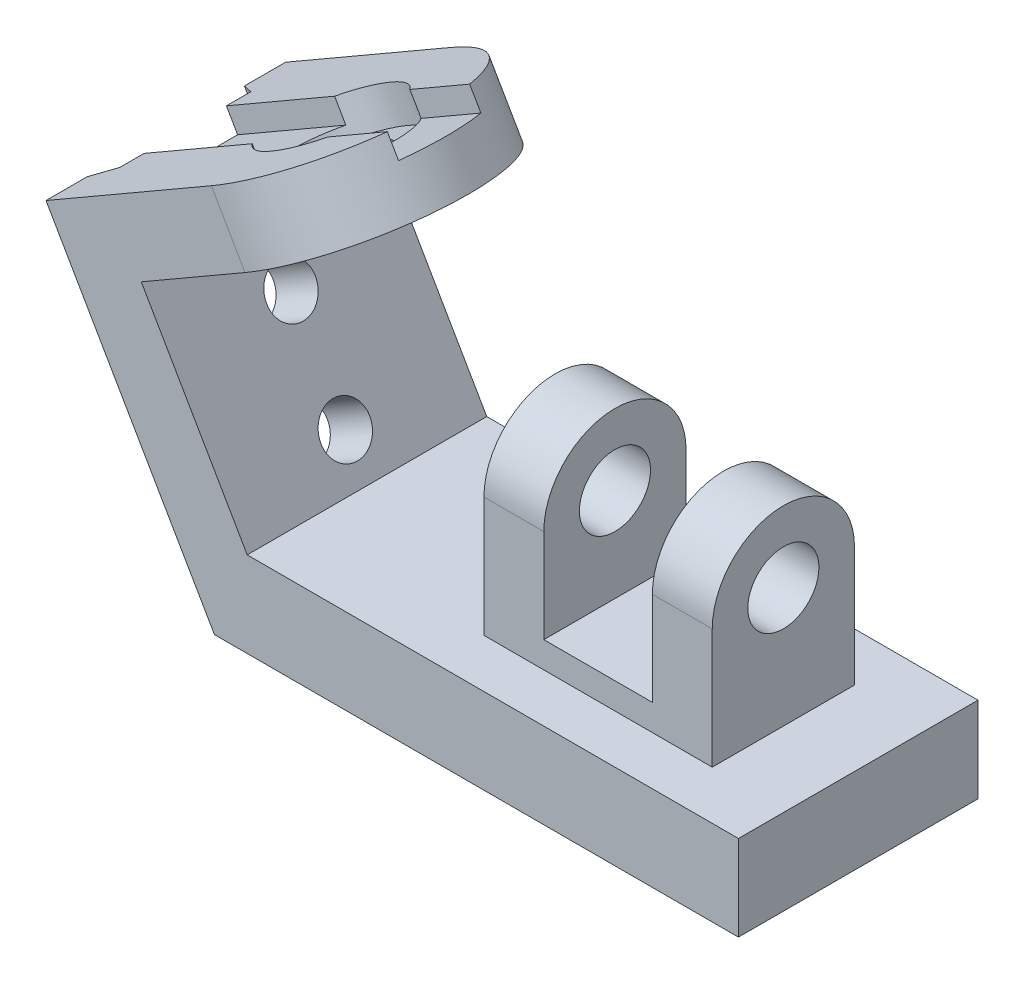
ISO-10303-21;
HEADER;
FILE_DESCRIPTION(('STEP AP214'),'2;1');
FILE_NAME('part.step','',(''),(''),'','','');
FILE_SCHEMA(('AUTOMOTIVE_DESIGN { 1 0 10303 214 1 1 1 1 }'));
ENDSEC;
DATA;
#1=APPLICATION_CONTEXT('core data for automotive mechanical design processes');
#2=APPLICATION_PROTOCOL_DEFINITION('international standard','automotive_design',2000,#1);
#3=PRODUCT_CONTEXT('',#1,'mechanical');
#4=PRODUCT('Part','Part','',(#3));
#5=PRODUCT_RELATED_PRODUCT_CATEGORY('part','',(#4));
#6=PRODUCT_DEFINITION_FORMATION('','',#4);
#7=PRODUCT_DEFINITION_CONTEXT('part definition',#1,'design');
#8=PRODUCT_DEFINITION('design','',#6,#7);
#9=PRODUCT_DEFINITION_SHAPE('','',#8);
#10=(LENGTH_UNIT() NAMED_UNIT(*) SI_UNIT(.MILLI.,.METRE.));
#11=(NAMED_UNIT(*) PLANE_ANGLE_UNIT() SI_UNIT($,.RADIAN.));
#12=(NAMED_UNIT(*) SI_UNIT($,.STERADIAN.) SOLID_ANGLE_UNIT());
#13=UNCERTAINTY_MEASURE_WITH_UNIT(LENGTH_MEASURE(1.E-05),#10,'distance_accuracy_value','');
#14=(GEOMETRIC_REPRESENTATION_CONTEXT(3) GLOBAL_UNCERTAINTY_ASSIGNED_CONTEXT((#13)) GLOBAL_UNIT_ASSIGNED_CONTEXT((#10,
#11,#12)) REPRESENTATION_CONTEXT('',''));
#15=CARTESIAN_POINT('',(0.,0.,0.));
#16=DIRECTION('',(0.,0.,1.));
#17=DIRECTION('',(1.,0.,0.));
#18=AXIS2_PLACEMENT_3D('',#15,#16,#17);
#19=CARTESIAN_POINT('',(120.,29.8306377793255,0.));
#20=DIRECTION('',(0.,1.,0.));
#21=DIRECTION('',(0.,0.,1.));
#22=AXIS2_PLACEMENT_3D('',#19,#20,#21);
#23=PLANE('',#22);
#24=DIRECTION('',(-1.,0.,0.));
#25=VECTOR('',#24,1.);
#26=CARTESIAN_POINT('',(120.,29.8306377793255,-19.));
#27=LINE('',#26,#25);
#28=CARTESIAN_POINT('',(104.,29.8306377793255,-19.));
#29=VERTEX_POINT('',#28);
#30=CARTESIAN_POINT('',(75.,29.8306377793255,-19.));
#31=VERTEX_POINT('',#30);
#32=EDGE_CURVE('E286',#29,#31,#27,.T.);
#33=ORIENTED_EDGE('',*,*,#32,.T.);
#34=DIRECTION('',(0.,0.,-1.));
#35=VECTOR('',#34,1.);
#36=CARTESIAN_POINT('',(75.,29.8306377793255,0.));
#37=LINE('',#36,#35);
#38=CARTESIAN_POINT('',(75.,29.8306377793255,19.));
#39=VERTEX_POINT('',#38);
#40=EDGE_CURVE('E859',#39,#31,#37,.T.);
#41=ORIENTED_EDGE('',*,*,#40,.F.);
#42=DIRECTION('',(-1.,0.,0.));
#43=VECTOR('',#42,1.);
#44=CARTESIAN_POINT('',(120.,29.8306377793255,19.));
#45=LINE('',#44,#43);
#46=CARTESIAN_POINT('',(104.,29.8306377793255,19.));
#47=VERTEX_POINT('',#46);
#48=EDGE_CURVE('E283',#47,#39,#45,.T.);
#49=ORIENTED_EDGE('',*,*,#48,.F.);
#50=DIRECTION('',(0.,0.,-1.));
#51=VECTOR('',#50,1.);
#52=CARTESIAN_POINT('',(104.,29.8306377793255,0.));
#53=LINE('',#52,#51);
#54=EDGE_CURVE('E265',#47,#29,#53,.T.);
#55=ORIENTED_EDGE('',*,*,#54,.T.);
#56=EDGE_LOOP('',(#33,#41,#49,#55));
#57=FACE_BOUND('',#56,.T.);
#58=ADVANCED_FACE('F35',(#57),#23,.T.);
#59=CARTESIAN_POINT('',(42.2563922654939,121.391584673323,11.));
#60=DIRECTION('',(0.,0.,1.));
#61=DIRECTION('',(1.,0.,0.));
#62=AXIS2_PLACEMENT_3D('',#59,#60,#61);
#63=PLANE('',#62);
#64=DIRECTION('',(0.866025403784436,0.500000000000004,0.));
#65=VECTOR('',#64,1.);
#66=CARTESIAN_POINT('',(42.2563922654939,121.391584673323,11.));
#67=LINE('',#66,#65);
#68=CARTESIAN_POINT('',(12.2296014917549,104.055608937204,11.));
#69=VERTEX_POINT('',#68);
#70=CARTESIAN_POINT('',(28.191322952352,113.27111311921,11.));
#71=VERTEX_POINT('',#70);
#72=EDGE_CURVE('E327',#69,#71,#67,.T.);
#73=ORIENTED_EDGE('',*,*,#72,.F.);
#74=DIRECTION('',(-0.500000000000004,0.866025403784436,0.));
#75=VECTOR('',#74,1.);
#76=CARTESIAN_POINT('',(13.7296014917549,101.457532725851,11.));
#77=LINE('',#76,#75);
#78=CARTESIAN_POINT('',(9.22960149175486,109.251761359911,11.));
#79=VERTEX_POINT('',#78);
#80=EDGE_CURVE('E311',#69,#79,#77,.T.);
#81=ORIENTED_EDGE('',*,*,#80,.T.);
#82=DIRECTION('',(0.866025403784436,0.500000000000004,0.));
#83=VECTOR('',#82,1.);
#84=CARTESIAN_POINT('',(39.2563922654938,126.58773709603,11.));
#85=LINE('',#84,#83);
#86=CARTESIAN_POINT('',(25.191322952352,118.467265541916,11.));
#87=VERTEX_POINT('',#86);
#88=EDGE_CURVE('E336',#79,#87,#85,.T.);
#89=ORIENTED_EDGE('',*,*,#88,.T.);
#90=DIRECTION('',(-0.500000000000004,0.866025403784436,0.));
#91=VECTOR('',#90,1.);
#92=CARTESIAN_POINT('',(34.1913229523521,102.878808273796,11.));
#93=LINE('',#92,#91);
#94=EDGE_CURVE('E345',#71,#87,#93,.T.);
#95=ORIENTED_EDGE('',*,*,#94,.F.);
#96=EDGE_LOOP('',(#73,#81,#89,#95));
#97=FACE_BOUND('',#96,.T.);
#98=ADVANCED_FACE('F478',(#97),#63,.F.);
#99=CARTESIAN_POINT('',(42.2563922654939,121.391584673323,-11.));
#100=DIRECTION('',(0.,0.,-1.));
#101=DIRECTION('',(-1.,0.,0.));
#102=AXIS2_PLACEMENT_3D('',#99,#100,#101);
#103=PLANE('',#102);
#104=DIRECTION('',(-0.866025403784436,-0.500000000000004,0.));
#105=VECTOR('',#104,1.);
#106=CARTESIAN_POINT('',(42.2563922654939,121.391584673323,-11.));
#107=LINE('',#106,#105);
#108=CARTESIAN_POINT('',(-7.89501030574315,92.4366588985817,-11.));
#109=VERTEX_POINT('',#108);
#110=CARTESIAN_POINT('',(-36.8038475772938,75.7461339178927,-11.));
#111=VERTEX_POINT('',#110);
#112=EDGE_CURVE('E328',#109,#111,#107,.T.);
#113=ORIENTED_EDGE('',*,*,#112,.F.);
#114=DIRECTION('',(-0.500000000000004,0.866025403784436,0.));
#115=VECTOR('',#114,1.);
#116=CARTESIAN_POINT('',(-6.39501030574311,89.8385826872284,-11.));
#117=LINE('',#116,#115);
#118=CARTESIAN_POINT('',(-10.8950103057431,97.6328113212883,-11.));
#119=VERTEX_POINT('',#118);
#120=EDGE_CURVE('E314',#109,#119,#117,.T.);
#121=ORIENTED_EDGE('',*,*,#120,.T.);
#122=DIRECTION('',(-0.866025403784436,-0.500000000000004,0.));
#123=VECTOR('',#122,1.);
#124=CARTESIAN_POINT('',(39.2563922654938,126.58773709603,-11.));
#125=LINE('',#124,#123);
#126=CARTESIAN_POINT('',(-39.8038475772938,80.9422863405993,-11.));
#127=VERTEX_POINT('',#126);
#128=EDGE_CURVE('E323',#119,#127,#125,.T.);
#129=ORIENTED_EDGE('',*,*,#128,.T.);
#130=DIRECTION('',(-0.500000000000004,0.866025403784436,0.));
#131=VECTOR('',#130,1.);
#132=CARTESIAN_POINT('',(40.1961524227072,-57.621778264911,-11.));
#133=LINE('',#132,#131);
#134=EDGE_CURVE('E446',#111,#127,#133,.T.);
#135=ORIENTED_EDGE('',*,*,#134,.F.);
#136=EDGE_LOOP('',(#113,#121,#129,#135));
#137=FACE_BOUND('',#136,.T.);
#138=ADVANCED_FACE('F472',(#137),#103,.F.);
#139=CARTESIAN_POINT('',(-42.0000000000004,72.7461339178927,0.));
#140=DIRECTION('',(0.500000000000004,-0.866025403784436,0.));
#141=DIRECTION('',(0.866025403784436,0.500000000000004,0.));
#142=AXIS2_PLACEMENT_3D('',#139,#140,#141);
#143=PLANE('',#142);
#144=CARTESIAN_POINT('',(-36.8038475772937,75.7461339178927,11.));
#145=VERTEX_POINT('',#144);
#146=CARTESIAN_POINT('',(-7.89501030574314,92.4366588985817,11.));
#147=VERTEX_POINT('',#146);
#148=EDGE_CURVE('E329',#145,#147,#67,.T.);
#149=ORIENTED_EDGE('',*,*,#148,.T.);
#150=CARTESIAN_POINT('',(2.16729559300585,98.2461339178929,0.));
#151=DIRECTION('',(0.500000000000004,-0.866025403784436,0.));
#152=DIRECTION('',(0.866025403784436,0.500000000000004,0.));
#153=AXIS2_PLACEMENT_3D('',#150,#151,#152);
#154=CIRCLE('',#153,16.);
#155=EDGE_CURVE('E11',#147,#109,#154,.T.);
#156=ORIENTED_EDGE('',*,*,#155,.T.);
#157=ORIENTED_EDGE('',*,*,#112,.T.);
#158=DIRECTION('',(0.,0.,-1.));
#159=VECTOR('',#158,1.);
#160=CARTESIAN_POINT('',(-36.8038475772938,75.7461339178927,-17.5358983848623));
#161=LINE('',#160,#159);
#162=EDGE_CURVE('E443',#145,#111,#161,.T.);
#163=ORIENTED_EDGE('',*,*,#162,.F.);
#164=EDGE_LOOP('',(#149,#156,#157,#163));
#165=FACE_BOUND('',#164,.T.);
#166=ADVANCED_FACE('F459',(#165),#143,.F.);
#167=CARTESIAN_POINT('',(17.167295593006,72.2653718043598,0.));
#168=DIRECTION('',(-0.500000000000004,0.866025403784436,0.));
#169=DIRECTION('',(-0.866025403784436,-0.500000000000004,0.));
#170=AXIS2_PLACEMENT_3D('',#167,#168,#169);
#171=CYLINDRICAL_SURFACE('',#170,9.5);
#172=CARTESIAN_POINT('',(8.16729559300591,87.8538290724796,0.));
#173=DIRECTION('',(-0.500000000000004,0.866025403784436,0.));
#174=DIRECTION('',(-0.866025403784436,-0.500000000000004,0.));
#175=AXIS2_PLACEMENT_3D('',#172,#173,#174);
#176=CIRCLE('',#175,9.5);
#177=CARTESIAN_POINT('',(-0.0599457429462345,83.1038290724796,0.));
#178=VERTEX_POINT('',#177);
#179=EDGE_CURVE('E320',#178,#178,#176,.T.);
#180=ORIENTED_EDGE('',*,*,#179,.F.);
#181=EDGE_LOOP('',(#180));
#182=FACE_BOUND('',#181,.T.);
#183=CARTESIAN_POINT('',(3.66729559300589,95.6480577065395,0.));
#184=DIRECTION('',(-0.500000000000004,0.866025403784436,0.));
#185=DIRECTION('',(-0.866025403784436,-0.500000000000004,0.));
#186=AXIS2_PLACEMENT_3D('',#183,#184,#185);
#187=CIRCLE('',#186,9.5);
#188=CARTESIAN_POINT('',(-4.55994574294625,90.8980577065395,0.));
#189=VERTEX_POINT('',#188);
#190=EDGE_CURVE('E305',#189,#189,#187,.F.);
#191=ORIENTED_EDGE('',*,*,#190,.F.);
#192=EDGE_LOOP('',(#191));
#193=FACE_BOUND('',#192,.T.);
#194=ADVANCED_FACE('F456',(#182,#193),#171,.F.);
#195=CARTESIAN_POINT('',(-28.5455173280961,87.4422863405993,32.));
#196=DIRECTION('',(0.500000000000004,-0.866025403784436,0.));
#197=DIRECTION('',(0.866025403784436,0.500000000000004,0.));
#198=AXIS2_PLACEMENT_3D('',#195,#196,#197);
#199=PLANE('',#198);
#200=ORIENTED_EDGE('',*,*,#88,.F.);
#201=CARTESIAN_POINT('',(-0.832704406994143,103.442286340599,0.));
#202=DIRECTION('',(-0.500000000000004,0.866025403784436,0.));
#203=DIRECTION('',(-0.866025403784436,-0.500000000000004,0.));
#204=AXIS2_PLACEMENT_3D('',#201,#202,#203);
#205=CIRCLE('',#204,16.);
#206=CARTESIAN_POINT('',(-10.8950103057431,97.6328113212883,11.));
#207=VERTEX_POINT('',#206);
#208=EDGE_CURVE('E306',#207,#79,#205,.T.);
#209=ORIENTED_EDGE('',*,*,#208,.F.);
#210=CARTESIAN_POINT('',(-39.8038475772938,80.9422863405993,11.));
#211=VERTEX_POINT('',#210);
#212=EDGE_CURVE('E337',#211,#207,#85,.T.);
#213=ORIENTED_EDGE('',*,*,#212,.F.);
#214=DIRECTION('',(0.,0.,-1.));
#215=VECTOR('',#214,1.);
#216=CARTESIAN_POINT('',(-39.8038475772938,80.9422863405993,-17.5358983848623));
#217=LINE('',#216,#215);
#218=CARTESIAN_POINT('',(-39.8038475772938,80.9422863405993,17.5358983848623));
#219=VERTEX_POINT('',#218);
#220=EDGE_CURVE('E352',#219,#211,#217,.T.);
#221=ORIENTED_EDGE('',*,*,#220,.F.);
#222=DIRECTION('',(0.750000000000001,0.433012701892225,-0.499999999999994));
#223=VECTOR('',#222,1.);
#224=CARTESIAN_POINT('',(-39.8038475772938,80.9422863405993,17.5358983848623));
#225=LINE('',#224,#223);
#226=CARTESIAN_POINT('',(-45.0000000000004,77.9422863405993,21.));
#227=VERTEX_POINT('',#226);
#228=EDGE_CURVE('E348',#227,#219,#225,.T.);
#229=ORIENTED_EDGE('',*,*,#228,.F.);
#230=DIRECTION('',(0.,0.,-1.));
#231=VECTOR('',#230,1.);
#232=CARTESIAN_POINT('',(-45.0000000000004,77.9422863405993,32.));
#233=LINE('',#232,#231);
#234=CARTESIAN_POINT('',(-45.0000000000004,77.9422863405993,32.));
#235=VERTEX_POINT('',#234);
#236=EDGE_CURVE('E425',#235,#227,#233,.T.);
#237=ORIENTED_EDGE('',*,*,#236,.F.);
#238=DIRECTION('',(-0.866025403784436,-0.500000000000004,0.));
#239=VECTOR('',#238,1.);
#240=CARTESIAN_POINT('',(-28.5455173280961,87.4422863405993,32.));
#241=LINE('',#240,#239);
#242=CARTESIAN_POINT('',(-0.832704406994147,103.442286340599,32.));
#243=VERTEX_POINT('',#242);
#244=EDGE_CURVE('E403',#243,#235,#241,.T.);
#245=ORIENTED_EDGE('',*,*,#244,.F.);
#246=CARTESIAN_POINT('',(-0.832704406994157,103.442286340599,0.));
#247=DIRECTION('',(-0.500000000000004,0.866025403784436,0.));
#248=DIRECTION('',(-0.866025403784436,-0.500000000000004,0.));
#249=AXIS2_PLACEMENT_3D('',#246,#247,#248);
#250=CIRCLE('',#249,32.);
#251=EDGE_CURVE('E371',#87,#243,#250,.F.);
#252=ORIENTED_EDGE('',*,*,#251,.F.);
#253=EDGE_LOOP('',(#200,#209,#213,#221,#229,#237,#245,#252));
#254=FACE_BOUND('',#253,.T.);
#255=ADVANCED_FACE('F458',(#254),#199,.F.);
#256=CARTESIAN_POINT('',(0.,0.,32.));
#257=DIRECTION('',(0.866025403784436,0.500000000000004,0.));
#258=DIRECTION('',(-0.500000000000004,0.866025403784436,0.));
#259=AXIS2_PLACEMENT_3D('',#256,#257,#258);
#260=PLANE('',#259);
#261=DIRECTION('',(0.,0.,-1.));
#262=VECTOR('',#261,1.);
#263=CARTESIAN_POINT('',(0.,0.,32.));
#264=LINE('',#263,#262);
#265=CARTESIAN_POINT('',(0.,0.,-21.));
#266=VERTEX_POINT('',#265);
#267=CARTESIAN_POINT('',(0.,0.,-32.));
#268=VERTEX_POINT('',#267);
#269=EDGE_CURVE('E407',#266,#268,#264,.T.);
#270=ORIENTED_EDGE('',*,*,#269,.F.);
#271=DIRECTION('',(-0.500000000000004,0.866025403784436,0.));
#272=VECTOR('',#271,1.);
#273=CARTESIAN_POINT('',(0.,0.,-21.));
#274=LINE('',#273,#272);
#275=CARTESIAN_POINT('',(-45.0000000000004,77.9422863405993,-21.));
#276=VERTEX_POINT('',#275);
#277=EDGE_CURVE('E440',#266,#276,#274,.T.);
#278=ORIENTED_EDGE('',*,*,#277,.T.);
#279=CARTESIAN_POINT('',(-45.0000000000004,77.9422863405993,-32.));
#280=VERTEX_POINT('',#279);
#281=EDGE_CURVE('E424',#276,#280,#233,.T.);
#282=ORIENTED_EDGE('',*,*,#281,.T.);
#283=DIRECTION('',(0.500000000000004,-0.866025403784436,0.));
#284=VECTOR('',#283,1.);
#285=CARTESIAN_POINT('',(0.,0.,-32.));
#286=LINE('',#285,#284);
#287=EDGE_CURVE('E396',#280,#268,#286,.T.);
#288=ORIENTED_EDGE('',*,*,#287,.T.);
#289=EDGE_LOOP('',(#270,#278,#282,#288));
#290=FACE_BOUND('',#289,.T.);
#291=ADVANCED_FACE('F467',(#290),#260,.F.);
#292=CARTESIAN_POINT('',(8.75803536154129,22.8306377793255,32.));
#293=DIRECTION('',(-0.866025403784436,-0.500000000000005,0.));
#294=DIRECTION('',(0.500000000000005,-0.866025403784436,0.));
#295=AXIS2_PLACEMENT_3D('',#292,#293,#294);
#296=PLANE('',#295);
#297=CARTESIAN_POINT('',(2.95448267190415,32.8826859021799,0.));
#298=DIRECTION('',(-0.866025403784436,-0.500000000000005,0.));
#299=DIRECTION('',(0.500000000000005,-0.866025403784436,0.));
#300=AXIS2_PLACEMENT_3D('',#297,#298,#299);
#301=CIRCLE('',#300,6.5);
#302=CARTESIAN_POINT('',(6.20448267190418,27.2535207775811,0.));
#303=VERTEX_POINT('',#302);
#304=EDGE_CURVE('E292',#303,#303,#301,.T.);
#305=ORIENTED_EDGE('',*,*,#304,.T.);
#306=EDGE_LOOP('',(#305));
#307=FACE_BOUND('',#306,.T.);
#308=CARTESIAN_POINT('',(-11.545517328096,57.9974226119285,0.));
#309=DIRECTION('',(-0.866025403784436,-0.500000000000005,0.));
#310=DIRECTION('',(0.500000000000005,-0.866025403784436,0.));
#311=AXIS2_PLACEMENT_3D('',#308,#309,#310);
#312=CIRCLE('',#311,6.5);
#313=CARTESIAN_POINT('',(-8.29551732809594,52.3682574873297,0.));
#314=VERTEX_POINT('',#313);
#315=EDGE_CURVE('E298',#314,#314,#312,.T.);
#316=ORIENTED_EDGE('',*,*,#315,.T.);
#317=EDGE_LOOP('',(#316));
#318=FACE_BOUND('',#317,.T.);
#319=DIRECTION('',(0.,0.,-1.));
#320=VECTOR('',#319,1.);
#321=CARTESIAN_POINT('',(-19.545517328096,71.8538290724795,0.));
#322=LINE('',#321,#320);
#323=CARTESIAN_POINT('',(-19.545517328096,71.8538290724795,32.));
#324=VERTEX_POINT('',#323);
#325=CARTESIAN_POINT('',(-19.545517328096,71.8538290724795,-32.));
#326=VERTEX_POINT('',#325);
#327=EDGE_CURVE('E377',#324,#326,#322,.T.);
#328=ORIENTED_EDGE('',*,*,#327,.F.);
#329=DIRECTION('',(-0.500000000000005,0.866025403784436,0.));
#330=VECTOR('',#329,1.);
#331=CARTESIAN_POINT('',(8.75803536154129,22.8306377793255,32.));
#332=LINE('',#331,#330);
#333=CARTESIAN_POINT('',(8.75803536154129,22.8306377793255,32.));
#334=VERTEX_POINT('',#333);
#335=EDGE_CURVE('E400',#334,#324,#332,.T.);
#336=ORIENTED_EDGE('',*,*,#335,.F.);
#337=DIRECTION('',(0.,0.,-1.));
#338=VECTOR('',#337,1.);
#339=CARTESIAN_POINT('',(8.75803536154129,22.8306377793255,32.));
#340=LINE('',#339,#338);
#341=CARTESIAN_POINT('',(8.75803536154129,22.8306377793255,-32.));
#342=VERTEX_POINT('',#341);
#343=EDGE_CURVE('E428',#334,#342,#340,.T.);
#344=ORIENTED_EDGE('',*,*,#343,.T.);
#345=DIRECTION('',(-0.500000000000005,0.866025403784436,0.));
#346=VECTOR('',#345,1.);
#347=CARTESIAN_POINT('',(8.75803536154129,22.8306377793255,-32.));
#348=LINE('',#347,#346);
#349=EDGE_CURVE('E414',#342,#326,#348,.T.);
#350=ORIENTED_EDGE('',*,*,#349,.T.);
#351=EDGE_LOOP('',(#328,#336,#344,#350));
#352=FACE_BOUND('',#351,.T.);
#353=ADVANCED_FACE('F582',(#307,#318,#352),#296,.F.);
#354=CARTESIAN_POINT('',(0.,0.,32.));
#355=DIRECTION('',(0.,1.,0.));
#356=DIRECTION('',(-1.,0.,0.));
#357=AXIS2_PLACEMENT_3D('',#354,#355,#356);
#358=PLANE('',#357);
#359=DIRECTION('',(0.,0.,-1.));
#360=VECTOR('',#359,1.);
#361=CARTESIAN_POINT('',(6.92820323027553,0.,32.));
#362=LINE('',#361,#360);
#363=CARTESIAN_POINT('',(6.92820323027552,0.,17.5358983848623));
#364=VERTEX_POINT('',#363);
#365=CARTESIAN_POINT('',(6.92820323027554,0.,-17.5358983848623));
#366=VERTEX_POINT('',#365);
#367=EDGE_CURVE('E368',#364,#366,#362,.T.);
#368=ORIENTED_EDGE('',*,*,#367,.T.);
#369=DIRECTION('',(-0.894427190999919,0.,-0.447213595499951));
#370=VECTOR('',#369,1.);
#371=CARTESIAN_POINT('',(21.1999999999997,0.,-10.4000000000003));
#372=LINE('',#371,#370);
#373=EDGE_CURVE('E365',#366,#266,#372,.T.);
#374=ORIENTED_EDGE('',*,*,#373,.T.);
#375=ORIENTED_EDGE('',*,*,#269,.T.);
#376=DIRECTION('',(1.,0.,0.));
#377=VECTOR('',#376,1.);
#378=CARTESIAN_POINT('',(0.,0.,-32.));
#379=LINE('',#378,#377);
#380=CARTESIAN_POINT('',(140.,0.,-32.));
#381=VERTEX_POINT('',#380);
#382=EDGE_CURVE('E389',#268,#381,#379,.T.);
#383=ORIENTED_EDGE('',*,*,#382,.T.);
#384=DIRECTION('',(0.,0.,-1.));
#385=VECTOR('',#384,1.);
#386=CARTESIAN_POINT('',(140.,0.,32.));
#387=LINE('',#386,#385);
#388=CARTESIAN_POINT('',(140.,0.,32.));
#389=VERTEX_POINT('',#388);
#390=EDGE_CURVE('E434',#389,#381,#387,.T.);
#391=ORIENTED_EDGE('',*,*,#390,.F.);
#392=DIRECTION('',(1.,0.,0.));
#393=VECTOR('',#392,1.);
#394=CARTESIAN_POINT('',(0.,0.,32.));
#395=LINE('',#394,#393);
#396=CARTESIAN_POINT('',(0.,0.,32.));
#397=VERTEX_POINT('',#396);
#398=EDGE_CURVE('E392',#397,#389,#395,.T.);
#399=ORIENTED_EDGE('',*,*,#398,.F.);
#400=CARTESIAN_POINT('',(0.,0.,21.));
#401=VERTEX_POINT('',#400);
#402=EDGE_CURVE('E421',#397,#401,#264,.T.);
#403=ORIENTED_EDGE('',*,*,#402,.T.);
#404=DIRECTION('',(0.894427190999919,0.,-0.447213595499951));
#405=VECTOR('',#404,1.);
#406=CARTESIAN_POINT('',(-4.39999999999995,0.,23.1999999999999));
#407=LINE('',#406,#405);
#408=EDGE_CURVE('E361',#401,#364,#407,.T.);
#409=ORIENTED_EDGE('',*,*,#408,.T.);
#410=EDGE_LOOP('',(#368,#374,#375,#383,#391,#399,#403,#409));
#411=FACE_BOUND('',#410,.T.);
#412=ADVANCED_FACE('F37',(#411),#358,.F.);
#413=CARTESIAN_POINT('',(140.,0.,32.));
#414=DIRECTION('',(-1.,0.,0.));
#415=DIRECTION('',(0.,0.,1.));
#416=AXIS2_PLACEMENT_3D('',#413,#414,#415);
#417=PLANE('',#416);
#418=DIRECTION('',(0.,1.,0.));
#419=VECTOR('',#418,1.);
#420=CARTESIAN_POINT('',(140.,0.,-32.));
#421=LINE('',#420,#419);
#422=CARTESIAN_POINT('',(140.,22.8306377793255,-32.));
#423=VERTEX_POINT('',#422);
#424=EDGE_CURVE('E410',#381,#423,#421,.T.);
#425=ORIENTED_EDGE('',*,*,#424,.T.);
#426=DIRECTION('',(0.,0.,-1.));
#427=VECTOR('',#426,1.);
#428=CARTESIAN_POINT('',(140.,22.8306377793255,32.));
#429=LINE('',#428,#427);
#430=CARTESIAN_POINT('',(140.,22.8306377793255,32.));
#431=VERTEX_POINT('',#430);
#432=EDGE_CURVE('E431',#431,#423,#429,.T.);
#433=ORIENTED_EDGE('',*,*,#432,.F.);
#434=DIRECTION('',(0.,1.,0.));
#435=VECTOR('',#434,1.);
#436=CARTESIAN_POINT('',(140.,0.,32.));
#437=LINE('',#436,#435);
#438=EDGE_CURVE('E395',#389,#431,#437,.T.);
#439=ORIENTED_EDGE('',*,*,#438,.F.);
#440=ORIENTED_EDGE('',*,*,#390,.T.);
#441=EDGE_LOOP('',(#425,#433,#439,#440));
#442=FACE_BOUND('',#441,.T.);
#443=ADVANCED_FACE('F573',(#442),#417,.F.);
#444=CARTESIAN_POINT('',(140.,22.8306377793255,32.));
#445=DIRECTION('',(0.,-1.,0.));
#446=DIRECTION('',(0.,0.,-1.));
#447=AXIS2_PLACEMENT_3D('',#444,#445,#446);
#448=PLANE('',#447);
#449=DIRECTION('',(-1.,0.,0.));
#450=VECTOR('',#449,1.);
#451=CARTESIAN_POINT('',(120.,22.8306377793255,-19.));
#452=LINE('',#451,#450);
#453=CARTESIAN_POINT('',(120.,22.8306377793255,-19.));
#454=VERTEX_POINT('',#453);
#455=CARTESIAN_POINT('',(59.,22.8306377793255,-19.));
#456=VERTEX_POINT('',#455);
#457=EDGE_CURVE('E58',#454,#456,#452,.T.);
#458=ORIENTED_EDGE('',*,*,#457,.F.);
#459=DIRECTION('',(0.,0.,-1.));
#460=VECTOR('',#459,1.);
#461=CARTESIAN_POINT('',(120.,22.8306377793255,0.));
#462=LINE('',#461,#460);
#463=CARTESIAN_POINT('',(120.,22.8306377793255,19.));
#464=VERTEX_POINT('',#463);
#465=EDGE_CURVE('E276',#464,#454,#462,.T.);
#466=ORIENTED_EDGE('',*,*,#465,.F.);
#467=DIRECTION('',(-1.,0.,0.));
#468=VECTOR('',#467,1.);
#469=CARTESIAN_POINT('',(120.,22.8306377793255,19.));
#470=LINE('',#469,#468);
#471=CARTESIAN_POINT('',(59.,22.8306377793255,19.));
#472=VERTEX_POINT('',#471);
#473=EDGE_CURVE('E281',#464,#472,#470,.T.);
#474=ORIENTED_EDGE('',*,*,#473,.T.);
#475=DIRECTION('',(0.,0.,-1.));
#476=VECTOR('',#475,1.);
#477=CARTESIAN_POINT('',(59.,22.8306377793255,0.));
#478=LINE('',#477,#476);
#479=EDGE_CURVE('E273',#472,#456,#478,.T.);
#480=ORIENTED_EDGE('',*,*,#479,.T.);
#481=EDGE_LOOP('',(#458,#466,#474,#480));
#482=FACE_BOUND('',#481,.T.);
#483=DIRECTION('',(-1.,0.,0.));
#484=VECTOR('',#483,1.);
#485=CARTESIAN_POINT('',(140.,22.8306377793255,-32.));
#486=LINE('',#485,#484);
#487=EDGE_CURVE('E412',#423,#342,#486,.T.);
#488=ORIENTED_EDGE('',*,*,#487,.T.);
#489=ORIENTED_EDGE('',*,*,#343,.F.);
#490=DIRECTION('',(-1.,0.,0.));
#491=VECTOR('',#490,1.);
#492=CARTESIAN_POINT('',(140.,22.8306377793255,32.));
#493=LINE('',#492,#491);
#494=EDGE_CURVE('E398',#431,#334,#493,.T.);
#495=ORIENTED_EDGE('',*,*,#494,.F.);
#496=ORIENTED_EDGE('',*,*,#432,.T.);
#497=EDGE_LOOP('',(#488,#489,#495,#496));
#498=FACE_BOUND('',#497,.T.);
#499=ADVANCED_FACE('F578',(#482,#498),#448,.F.);
#500=ORIENTED_EDGE('',*,*,#128,.F.);
#501=CARTESIAN_POINT('',(9.22960149175487,109.251761359911,-11.));
#502=VERTEX_POINT('',#501);
#503=EDGE_CURVE('E301',#502,#119,#205,.T.);
#504=ORIENTED_EDGE('',*,*,#503,.F.);
#505=CARTESIAN_POINT('',(25.191322952352,118.467265541916,-11.));
#506=VERTEX_POINT('',#505);
#507=EDGE_CURVE('E333',#506,#502,#125,.T.);
#508=ORIENTED_EDGE('',*,*,#507,.F.);
#509=CARTESIAN_POINT('',(-0.832704406994154,103.442286340599,-32.));
#510=VERTEX_POINT('',#509);
#511=EDGE_CURVE('E375',#510,#506,#250,.F.);
#512=ORIENTED_EDGE('',*,*,#511,.F.);
#513=DIRECTION('',(-0.866025403784436,-0.500000000000004,0.));
#514=VECTOR('',#513,1.);
#515=CARTESIAN_POINT('',(-28.5455173280961,87.4422863405993,-32.));
#516=LINE('',#515,#514);
#517=EDGE_CURVE('E416',#510,#280,#516,.T.);
#518=ORIENTED_EDGE('',*,*,#517,.T.);
#519=ORIENTED_EDGE('',*,*,#281,.F.);
#520=DIRECTION('',(-0.750000000000001,-0.433012701892225,-0.499999999999994));
#521=VECTOR('',#520,1.);
#522=CARTESIAN_POINT('',(-45.0000000000004,77.9422863405993,-21.));
#523=LINE('',#522,#521);
#524=CARTESIAN_POINT('',(-39.8038475772938,80.9422863405993,-17.5358983848623));
#525=VERTEX_POINT('',#524);
#526=EDGE_CURVE('E355',#525,#276,#523,.T.);
#527=ORIENTED_EDGE('',*,*,#526,.F.);
#528=EDGE_CURVE('E351',#127,#525,#217,.T.);
#529=ORIENTED_EDGE('',*,*,#528,.F.);
#530=EDGE_LOOP('',(#500,#504,#508,#512,#518,#519,#527,#529));
#531=FACE_BOUND('',#530,.T.);
#532=ADVANCED_FACE('F470',(#531),#199,.F.);
#533=ORIENTED_EDGE('',*,*,#236,.T.);
#534=DIRECTION('',(0.500000000000004,-0.866025403784436,0.));
#535=VECTOR('',#534,1.);
#536=CARTESIAN_POINT('',(0.,0.,21.));
#537=LINE('',#536,#535);
#538=EDGE_CURVE('E437',#227,#401,#537,.T.);
#539=ORIENTED_EDGE('',*,*,#538,.T.);
#540=ORIENTED_EDGE('',*,*,#402,.F.);
#541=DIRECTION('',(0.500000000000004,-0.866025403784436,0.));
#542=VECTOR('',#541,1.);
#543=CARTESIAN_POINT('',(0.,0.,32.));
#544=LINE('',#543,#542);
#545=EDGE_CURVE('E405',#235,#397,#544,.T.);
#546=ORIENTED_EDGE('',*,*,#545,.F.);
#547=EDGE_LOOP('',(#533,#539,#540,#546));
#548=FACE_BOUND('',#547,.T.);
#549=ADVANCED_FACE('F550',(#548),#260,.F.);
#550=CARTESIAN_POINT('',(0.,0.,32.));
#551=DIRECTION('',(0.,0.,1.));
#552=DIRECTION('',(1.,0.,0.));
#553=AXIS2_PLACEMENT_3D('',#550,#551,#552);
#554=PLANE('',#553);
#555=ORIENTED_EDGE('',*,*,#398,.T.);
#556=ORIENTED_EDGE('',*,*,#438,.T.);
#557=ORIENTED_EDGE('',*,*,#494,.T.);
#558=ORIENTED_EDGE('',*,*,#335,.T.);
#559=DIRECTION('',(0.866025403784436,0.500000000000004,0.));
#560=VECTOR('',#559,1.);
#561=CARTESIAN_POINT('',(-36.0000000000003,62.3538290724794,32.));
#562=LINE('',#561,#560);
#563=CARTESIAN_POINT('',(8.16729559300593,87.8538290724796,32.));
#564=VERTEX_POINT('',#563);
#565=EDGE_CURVE('E380',#324,#564,#562,.T.);
#566=ORIENTED_EDGE('',*,*,#565,.T.);
#567=DIRECTION('',(-0.500000000000004,0.866025403784436,0.));
#568=VECTOR('',#567,1.);
#569=CARTESIAN_POINT('',(8.16729559300593,87.8538290724796,32.));
#570=LINE('',#569,#568);
#571=EDGE_CURVE('E386',#564,#243,#570,.T.);
#572=ORIENTED_EDGE('',*,*,#571,.T.);
#573=ORIENTED_EDGE('',*,*,#244,.T.);
#574=ORIENTED_EDGE('',*,*,#545,.T.);
#575=EDGE_LOOP('',(#555,#556,#557,#558,#566,#572,#573,#574));
#576=FACE_BOUND('',#575,.T.);
#577=ADVANCED_FACE('F554',(#576),#554,.T.);
#578=CARTESIAN_POINT('',(0.,0.,-32.));
#579=DIRECTION('',(0.,0.,1.));
#580=DIRECTION('',(1.,0.,0.));
#581=AXIS2_PLACEMENT_3D('',#578,#579,#580);
#582=PLANE('',#581);
#583=ORIENTED_EDGE('',*,*,#382,.F.);
#584=ORIENTED_EDGE('',*,*,#287,.F.);
#585=ORIENTED_EDGE('',*,*,#517,.F.);
#586=DIRECTION('',(-0.500000000000004,0.866025403784436,0.));
#587=VECTOR('',#586,1.);
#588=CARTESIAN_POINT('',(8.16729559300592,87.8538290724796,-32.));
#589=LINE('',#588,#587);
#590=CARTESIAN_POINT('',(8.16729559300592,87.8538290724796,-32.));
#591=VERTEX_POINT('',#590);
#592=EDGE_CURVE('E383',#591,#510,#589,.T.);
#593=ORIENTED_EDGE('',*,*,#592,.F.);
#594=DIRECTION('',(0.866025403784436,0.500000000000004,0.));
#595=VECTOR('',#594,1.);
#596=CARTESIAN_POINT('',(-36.0000000000003,62.3538290724794,-32.));
#597=LINE('',#596,#595);
#598=EDGE_CURVE('E374',#326,#591,#597,.T.);
#599=ORIENTED_EDGE('',*,*,#598,.F.);
#600=ORIENTED_EDGE('',*,*,#349,.F.);
#601=ORIENTED_EDGE('',*,*,#487,.F.);
#602=ORIENTED_EDGE('',*,*,#424,.F.);
#603=EDGE_LOOP('',(#583,#584,#585,#593,#599,#600,#601,#602));
#604=FACE_BOUND('',#603,.T.);
#605=ADVANCED_FACE('F566',(#604),#582,.F.);
#606=CARTESIAN_POINT('',(8.16729559300592,87.8538290724796,0.));
#607=DIRECTION('',(-0.500000000000004,0.866025403784436,0.));
#608=DIRECTION('',(-0.866025403784436,-0.500000000000004,0.));
#609=AXIS2_PLACEMENT_3D('',#606,#607,#608);
#610=CYLINDRICAL_SURFACE('',#609,32.);
#611=CARTESIAN_POINT('',(2.16729559300586,98.2461339178929,0.));
#612=DIRECTION('',(0.500000000000004,-0.866025403784436,0.));
#613=DIRECTION('',(0.866025403784436,0.500000000000004,0.));
#614=AXIS2_PLACEMENT_3D('',#611,#612,#613);
#615=CIRCLE('',#614,32.);
#616=CARTESIAN_POINT('',(28.191322952352,113.27111311921,-11.));
#617=VERTEX_POINT('',#616);
#618=EDGE_CURVE('E332',#617,#71,#615,.T.);
#619=ORIENTED_EDGE('',*,*,#618,.T.);
#620=ORIENTED_EDGE('',*,*,#94,.T.);
#621=ORIENTED_EDGE('',*,*,#251,.T.);
#622=ORIENTED_EDGE('',*,*,#571,.F.);
#623=CARTESIAN_POINT('',(8.16729559300592,87.8538290724796,0.));
#624=DIRECTION('',(-0.500000000000004,0.866025403784436,0.));
#625=DIRECTION('',(-0.866025403784436,-0.500000000000004,0.));
#626=AXIS2_PLACEMENT_3D('',#623,#624,#625);
#627=CIRCLE('',#626,32.);
#628=EDGE_CURVE('E372',#591,#564,#627,.F.);
#629=ORIENTED_EDGE('',*,*,#628,.F.);
#630=ORIENTED_EDGE('',*,*,#592,.T.);
#631=ORIENTED_EDGE('',*,*,#511,.T.);
#632=DIRECTION('',(-0.500000000000004,0.866025403784436,0.));
#633=VECTOR('',#632,1.);
#634=CARTESIAN_POINT('',(34.1913229523521,102.878808273796,-11.));
#635=LINE('',#634,#633);
#636=EDGE_CURVE('E342',#506,#617,#635,.F.);
#637=ORIENTED_EDGE('',*,*,#636,.T.);
#638=EDGE_LOOP('',(#619,#620,#621,#622,#629,#630,#631,#637));
#639=FACE_BOUND('',#638,.T.);
#640=ADVANCED_FACE('F524',(#639),#610,.T.);
#641=CARTESIAN_POINT('',(-36.0000000000003,62.3538290724794,0.));
#642=DIRECTION('',(-0.500000000000004,0.866025403784436,0.));
#643=DIRECTION('',(-0.866025403784436,-0.500000000000004,0.));
#644=AXIS2_PLACEMENT_3D('',#641,#642,#643);
#645=PLANE('',#644);
#646=ORIENTED_EDGE('',*,*,#179,.T.);
#647=EDGE_LOOP('',(#646));
#648=FACE_BOUND('',#647,.T.);
#649=ORIENTED_EDGE('',*,*,#628,.T.);
#650=ORIENTED_EDGE('',*,*,#565,.F.);
#651=ORIENTED_EDGE('',*,*,#327,.T.);
#652=ORIENTED_EDGE('',*,*,#598,.T.);
#653=EDGE_LOOP('',(#649,#650,#651,#652));
#654=FACE_BOUND('',#653,.T.);
#655=ADVANCED_FACE('F559',(#648,#654),#645,.F.);
#656=CARTESIAN_POINT('',(40.1961524227072,-57.621778264911,-17.5358983848623));
#657=DIRECTION('',(0.866025403784436,0.500000000000004,0.));
#658=DIRECTION('',(-0.500000000000004,0.866025403784436,0.));
#659=AXIS2_PLACEMENT_3D('',#656,#657,#658);
#660=PLANE('',#659);
#661=CARTESIAN_POINT('',(-8.3038475772935,26.3826859021798,0.));
#662=DIRECTION('',(-0.866025403784436,-0.500000000000004,0.));
#663=DIRECTION('',(0.500000000000004,-0.866025403784436,0.));
#664=AXIS2_PLACEMENT_3D('',#661,#662,#663);
#665=CIRCLE('',#664,6.5);
#666=CARTESIAN_POINT('',(-5.05384757729347,20.753520777581,0.));
#667=VERTEX_POINT('',#666);
#668=EDGE_CURVE('E289',#667,#667,#665,.T.);
#669=ORIENTED_EDGE('',*,*,#668,.F.);
#670=EDGE_LOOP('',(#669));
#671=FACE_BOUND('',#670,.T.);
#672=CARTESIAN_POINT('',(-22.8038475772936,51.4974226119285,0.));
#673=DIRECTION('',(-0.866025403784436,-0.500000000000004,0.));
#674=DIRECTION('',(0.500000000000004,-0.866025403784436,0.));
#675=AXIS2_PLACEMENT_3D('',#672,#673,#674);
#676=CIRCLE('',#675,6.5);
#677=CARTESIAN_POINT('',(-19.5538475772936,45.8682574873297,0.));
#678=VERTEX_POINT('',#677);
#679=EDGE_CURVE('E295',#678,#678,#676,.T.);
#680=ORIENTED_EDGE('',*,*,#679,.F.);
#681=EDGE_LOOP('',(#680));
#682=FACE_BOUND('',#681,.T.);
#683=ORIENTED_EDGE('',*,*,#220,.T.);
#684=DIRECTION('',(0.500000000000004,-0.866025403784436,0.));
#685=VECTOR('',#684,1.);
#686=CARTESIAN_POINT('',(40.1961524227072,-57.621778264911,11.));
#687=LINE('',#686,#685);
#688=EDGE_CURVE('E449',#211,#145,#687,.T.);
#689=ORIENTED_EDGE('',*,*,#688,.T.);
#690=ORIENTED_EDGE('',*,*,#162,.T.);
#691=ORIENTED_EDGE('',*,*,#134,.T.);
#692=ORIENTED_EDGE('',*,*,#528,.T.);
#693=DIRECTION('',(-0.500000000000004,0.866025403784436,0.));
#694=VECTOR('',#693,1.);
#695=CARTESIAN_POINT('',(40.1961524227072,-57.621778264911,-17.5358983848623));
#696=LINE('',#695,#694);
#697=EDGE_CURVE('E358',#366,#525,#696,.T.);
#698=ORIENTED_EDGE('',*,*,#697,.F.);
#699=ORIENTED_EDGE('',*,*,#367,.F.);
#700=DIRECTION('',(-0.500000000000004,0.866025403784436,0.));
#701=VECTOR('',#700,1.);
#702=CARTESIAN_POINT('',(40.1961524227072,-57.621778264911,17.5358983848623));
#703=LINE('',#702,#701);
#704=EDGE_CURVE('E357',#364,#219,#703,.T.);
#705=ORIENTED_EDGE('',*,*,#704,.T.);
#706=EDGE_LOOP('',(#683,#689,#690,#691,#692,#698,#699,#705));
#707=FACE_BOUND('',#706,.T.);
#708=ADVANCED_FACE('F539',(#671,#682,#707),#660,.F.);
#709=CARTESIAN_POINT('',(35.0000000000006,-60.621778264911,-21.));
#710=DIRECTION('',(0.433012701892213,0.249999999999999,-0.866025403784442));
#711=DIRECTION('',(-0.894427190999919,0.,-0.447213595499951));
#712=AXIS2_PLACEMENT_3D('',#709,#710,#711);
#713=PLANE('',#712);
#714=ORIENTED_EDGE('',*,*,#697,.T.);
#715=ORIENTED_EDGE('',*,*,#526,.T.);
#716=ORIENTED_EDGE('',*,*,#277,.F.);
#717=ORIENTED_EDGE('',*,*,#373,.F.);
#718=EDGE_LOOP('',(#714,#715,#716,#717));
#719=FACE_BOUND('',#718,.T.);
#720=ADVANCED_FACE('F570',(#719),#713,.F.);
#721=CARTESIAN_POINT('',(40.1961524227072,-57.621778264911,17.5358983848623));
#722=DIRECTION('',(0.433012701892213,0.249999999999999,0.866025403784442));
#723=DIRECTION('',(0.894427190999919,0.,-0.447213595499951));
#724=AXIS2_PLACEMENT_3D('',#721,#722,#723);
#725=PLANE('',#724);
#726=ORIENTED_EDGE('',*,*,#538,.F.);
#727=ORIENTED_EDGE('',*,*,#228,.T.);
#728=ORIENTED_EDGE('',*,*,#704,.F.);
#729=ORIENTED_EDGE('',*,*,#408,.F.);
#730=EDGE_LOOP('',(#726,#727,#728,#729));
#731=FACE_BOUND('',#730,.T.);
#732=ADVANCED_FACE('F547',(#731),#725,.F.);
#733=ORIENTED_EDGE('',*,*,#212,.T.);
#734=DIRECTION('',(-0.500000000000004,0.866025403784436,0.));
#735=VECTOR('',#734,1.);
#736=CARTESIAN_POINT('',(-6.39501030574311,89.8385826872284,11.));
#737=LINE('',#736,#735);
#738=EDGE_CURVE('E317',#207,#147,#737,.F.);
#739=ORIENTED_EDGE('',*,*,#738,.T.);
#740=ORIENTED_EDGE('',*,*,#148,.F.);
#741=ORIENTED_EDGE('',*,*,#688,.F.);
#742=EDGE_LOOP('',(#733,#739,#740,#741));
#743=FACE_BOUND('',#742,.T.);
#744=ADVANCED_FACE('F487',(#743),#63,.F.);
#745=ORIENTED_EDGE('',*,*,#507,.T.);
#746=DIRECTION('',(-0.500000000000004,0.866025403784436,0.));
#747=VECTOR('',#746,1.);
#748=CARTESIAN_POINT('',(13.7296014917549,101.457532725851,-11.));
#749=LINE('',#748,#747);
#750=CARTESIAN_POINT('',(12.2296014917549,104.055608937204,-11.));
#751=VERTEX_POINT('',#750);
#752=EDGE_CURVE('E308',#502,#751,#749,.F.);
#753=ORIENTED_EDGE('',*,*,#752,.T.);
#754=EDGE_CURVE('E324',#617,#751,#107,.T.);
#755=ORIENTED_EDGE('',*,*,#754,.F.);
#756=ORIENTED_EDGE('',*,*,#636,.F.);
#757=EDGE_LOOP('',(#745,#753,#755,#756));
#758=FACE_BOUND('',#757,.T.);
#759=ADVANCED_FACE('F509',(#758),#103,.F.);
#760=ORIENTED_EDGE('',*,*,#754,.T.);
#761=EDGE_CURVE('E39',#751,#69,#154,.T.);
#762=ORIENTED_EDGE('',*,*,#761,.T.);
#763=ORIENTED_EDGE('',*,*,#72,.T.);
#764=ORIENTED_EDGE('',*,*,#618,.F.);
#765=EDGE_LOOP('',(#760,#762,#763,#764));
#766=FACE_BOUND('',#765,.T.);
#767=ADVANCED_FACE('F475',(#766),#143,.F.);
#768=CARTESIAN_POINT('',(3.66729559300589,95.6480577065395,0.));
#769=DIRECTION('',(-0.500000000000004,0.866025403784436,0.));
#770=DIRECTION('',(-0.866025403784436,-0.500000000000004,0.));
#771=AXIS2_PLACEMENT_3D('',#768,#769,#770);
#772=CYLINDRICAL_SURFACE('',#771,16.);
#773=CARTESIAN_POINT('',(3.66729559300589,95.6480577065395,0.));
#774=DIRECTION('',(-0.500000000000004,0.866025403784436,0.));
#775=DIRECTION('',(-0.866025403784436,-0.500000000000004,0.));
#776=AXIS2_PLACEMENT_3D('',#773,#774,#775);
#777=CIRCLE('',#776,16.);
#778=CARTESIAN_POINT('',(-10.1891108675451,87.6480577065395,0.));
#779=VERTEX_POINT('',#778);
#780=EDGE_CURVE('E302',#779,#779,#777,.T.);
#781=ORIENTED_EDGE('',*,*,#780,.F.);
#782=EDGE_LOOP('',(#781));
#783=FACE_BOUND('',#782,.T.);
#784=ORIENTED_EDGE('',*,*,#208,.T.);
#785=ORIENTED_EDGE('',*,*,#80,.F.);
#786=ORIENTED_EDGE('',*,*,#761,.F.);
#787=ORIENTED_EDGE('',*,*,#752,.F.);
#788=ORIENTED_EDGE('',*,*,#503,.T.);
#789=ORIENTED_EDGE('',*,*,#120,.F.);
#790=ORIENTED_EDGE('',*,*,#155,.F.);
#791=ORIENTED_EDGE('',*,*,#738,.F.);
#792=EDGE_LOOP('',(#784,#785,#786,#787,#788,#789,#790,#791));
#793=FACE_BOUND('',#792,.T.);
#794=ADVANCED_FACE('F503',(#783,#793),#772,.F.);
#795=CARTESIAN_POINT('',(-40.5000000000003,70.1480577065393,0.));
#796=DIRECTION('',(-0.500000000000004,0.866025403784436,0.));
#797=DIRECTION('',(-0.866025403784436,-0.500000000000004,0.));
#798=AXIS2_PLACEMENT_3D('',#795,#796,#797);
#799=PLANE('',#798);
#800=ORIENTED_EDGE('',*,*,#780,.T.);
#801=EDGE_LOOP('',(#800));
#802=FACE_BOUND('',#801,.T.);
#803=ORIENTED_EDGE('',*,*,#190,.T.);
#804=EDGE_LOOP('',(#803));
#805=FACE_BOUND('',#804,.T.);
#806=ADVANCED_FACE('F454',(#802,#805),#799,.T.);
#807=CARTESIAN_POINT('',(128.297830738088,138.736017262319,0.));
#808=DIRECTION('',(-0.866025403784436,-0.500000000000004,0.));
#809=DIRECTION('',(0.500000000000004,-0.866025403784436,0.));
#810=AXIS2_PLACEMENT_3D('',#807,#808,#809);
#811=CYLINDRICAL_SURFACE('',#810,6.5);
#812=ORIENTED_EDGE('',*,*,#679,.T.);
#813=EDGE_LOOP('',(#812));
#814=FACE_BOUND('',#813,.T.);
#815=ORIENTED_EDGE('',*,*,#315,.F.);
#816=EDGE_LOOP('',(#815));
#817=FACE_BOUND('',#816,.T.);
#818=ADVANCED_FACE('F497',(#814,#817),#811,.F.);
#819=CARTESIAN_POINT('',(142.797830738088,113.62128055257,0.));
#820=DIRECTION('',(-0.866025403784436,-0.500000000000004,0.));
#821=DIRECTION('',(0.500000000000004,-0.866025403784436,0.));
#822=AXIS2_PLACEMENT_3D('',#819,#820,#821);
#823=CYLINDRICAL_SURFACE('',#822,6.5);
#824=ORIENTED_EDGE('',*,*,#668,.T.);
#825=EDGE_LOOP('',(#824));
#826=FACE_BOUND('',#825,.T.);
#827=ORIENTED_EDGE('',*,*,#304,.F.);
#828=EDGE_LOOP('',(#827));
#829=FACE_BOUND('',#828,.T.);
#830=ADVANCED_FACE('F494',(#826,#829),#823,.F.);
#831=CARTESIAN_POINT('',(120.,0.,-19.));
#832=DIRECTION('',(0.,0.,-1.));
#833=DIRECTION('',(0.,1.,0.));
#834=AXIS2_PLACEMENT_3D('',#831,#832,#833);
#835=PLANE('',#834);
#836=DIRECTION('',(0.,-1.,0.));
#837=VECTOR('',#836,1.);
#838=CARTESIAN_POINT('',(59.,0.,-19.));
#839=LINE('',#838,#837);
#840=CARTESIAN_POINT('',(59.,54.8306377793255,-19.));
#841=VERTEX_POINT('',#840);
#842=EDGE_CURVE('E221',#841,#456,#839,.T.);
#843=ORIENTED_EDGE('',*,*,#842,.F.);
#844=DIRECTION('',(1.,0.,0.));
#845=VECTOR('',#844,1.);
#846=CARTESIAN_POINT('',(59.,54.8306377793255,-19.));
#847=LINE('',#846,#845);
#848=CARTESIAN_POINT('',(75.,54.8306377793255,-19.));
#849=VERTEX_POINT('',#848);
#850=EDGE_CURVE('E225',#841,#849,#847,.T.);
#851=ORIENTED_EDGE('',*,*,#850,.T.);
#852=DIRECTION('',(0.,-1.,0.));
#853=VECTOR('',#852,1.);
#854=CARTESIAN_POINT('',(75.,0.,-19.));
#855=LINE('',#854,#853);
#856=EDGE_CURVE('E855',#849,#31,#855,.T.);
#857=ORIENTED_EDGE('',*,*,#856,.T.);
#858=ORIENTED_EDGE('',*,*,#32,.F.);
#859=DIRECTION('',(0.,-1.,0.));
#860=VECTOR('',#859,1.);
#861=CARTESIAN_POINT('',(104.,0.,-19.));
#862=LINE('',#861,#860);
#863=CARTESIAN_POINT('',(104.,54.8306377793255,-19.));
#864=VERTEX_POINT('',#863);
#865=EDGE_CURVE('E50',#864,#29,#862,.T.);
#866=ORIENTED_EDGE('',*,*,#865,.F.);
#867=DIRECTION('',(-1.,0.,0.));
#868=VECTOR('',#867,1.);
#869=CARTESIAN_POINT('',(120.,54.8306377793255,-19.));
#870=LINE('',#869,#868);
#871=CARTESIAN_POINT('',(120.,54.8306377793255,-19.));
#872=VERTEX_POINT('',#871);
#873=EDGE_CURVE('E259',#872,#864,#870,.T.);
#874=ORIENTED_EDGE('',*,*,#873,.F.);
#875=DIRECTION('',(0.,-1.,0.));
#876=VECTOR('',#875,1.);
#877=CARTESIAN_POINT('',(120.,0.,-19.));
#878=LINE('',#877,#876);
#879=EDGE_CURVE('E270',#872,#454,#878,.T.);
#880=ORIENTED_EDGE('',*,*,#879,.T.);
#881=ORIENTED_EDGE('',*,*,#457,.T.);
#882=EDGE_LOOP('',(#843,#851,#857,#858,#866,#874,#880,#881));
#883=FACE_BOUND('',#882,.T.);
#884=ADVANCED_FACE('F223',(#883),#835,.T.);
#885=CARTESIAN_POINT('',(120.,0.,19.));
#886=DIRECTION('',(0.,0.,-1.));
#887=DIRECTION('',(0.,1.,0.));
#888=AXIS2_PLACEMENT_3D('',#885,#886,#887);
#889=PLANE('',#888);
#890=DIRECTION('',(0.,-1.,0.));
#891=VECTOR('',#890,1.);
#892=CARTESIAN_POINT('',(59.,0.,19.));
#893=LINE('',#892,#891);
#894=CARTESIAN_POINT('',(59.,54.8306377793255,19.));
#895=VERTEX_POINT('',#894);
#896=EDGE_CURVE('E230',#895,#472,#893,.T.);
#897=ORIENTED_EDGE('',*,*,#896,.T.);
#898=ORIENTED_EDGE('',*,*,#473,.F.);
#899=DIRECTION('',(0.,-1.,0.));
#900=VECTOR('',#899,1.);
#901=CARTESIAN_POINT('',(120.,0.,19.));
#902=LINE('',#901,#900);
#903=CARTESIAN_POINT('',(120.,54.8306377793255,19.));
#904=VERTEX_POINT('',#903);
#905=EDGE_CURVE('E272',#904,#464,#902,.T.);
#906=ORIENTED_EDGE('',*,*,#905,.F.);
#907=DIRECTION('',(-1.,0.,0.));
#908=VECTOR('',#907,1.);
#909=CARTESIAN_POINT('',(120.,54.8306377793255,19.));
#910=LINE('',#909,#908);
#911=CARTESIAN_POINT('',(104.,54.8306377793255,19.));
#912=VERTEX_POINT('',#911);
#913=EDGE_CURVE('E231',#904,#912,#910,.T.);
#914=ORIENTED_EDGE('',*,*,#913,.T.);
#915=DIRECTION('',(0.,-1.,0.));
#916=VECTOR('',#915,1.);
#917=CARTESIAN_POINT('',(104.,0.,19.));
#918=LINE('',#917,#916);
#919=EDGE_CURVE('E262',#912,#47,#918,.T.);
#920=ORIENTED_EDGE('',*,*,#919,.T.);
#921=ORIENTED_EDGE('',*,*,#48,.T.);
#922=DIRECTION('',(0.,-1.,0.));
#923=VECTOR('',#922,1.);
#924=CARTESIAN_POINT('',(75.,0.,19.));
#925=LINE('',#924,#923);
#926=CARTESIAN_POINT('',(75.,54.8306377793255,19.));
#927=VERTEX_POINT('',#926);
#928=EDGE_CURVE('E863',#927,#39,#925,.T.);
#929=ORIENTED_EDGE('',*,*,#928,.F.);
#930=DIRECTION('',(1.,0.,0.));
#931=VECTOR('',#930,1.);
#932=CARTESIAN_POINT('',(59.,54.8306377793255,19.));
#933=LINE('',#932,#931);
#934=EDGE_CURVE('E240',#895,#927,#933,.T.);
#935=ORIENTED_EDGE('',*,*,#934,.F.);
#936=EDGE_LOOP('',(#897,#898,#906,#914,#920,#921,#929,#935));
#937=FACE_BOUND('',#936,.T.);
#938=ADVANCED_FACE('F490',(#937),#889,.F.);
#939=CARTESIAN_POINT('',(120.,0.,0.));
#940=DIRECTION('',(1.,0.,0.));
#941=DIRECTION('',(0.,0.,-1.));
#942=AXIS2_PLACEMENT_3D('',#939,#940,#941);
#943=PLANE('',#942);
#944=ORIENTED_EDGE('',*,*,#879,.F.);
#945=CARTESIAN_POINT('',(120.,54.8306377793255,0.));
#946=DIRECTION('',(1.,0.,0.));
#947=DIRECTION('',(0.,0.,-1.));
#948=AXIS2_PLACEMENT_3D('',#945,#946,#947);
#949=CIRCLE('',#948,19.);
#950=EDGE_CURVE('E257',#904,#872,#949,.F.);
#951=ORIENTED_EDGE('',*,*,#950,.F.);
#952=ORIENTED_EDGE('',*,*,#905,.T.);
#953=ORIENTED_EDGE('',*,*,#465,.T.);
#954=EDGE_LOOP('',(#944,#951,#952,#953));
#955=FACE_BOUND('',#954,.T.);
#956=CARTESIAN_POINT('',(120.,54.8306377793255,0.));
#957=DIRECTION('',(1.,0.,0.));
#958=DIRECTION('',(0.,0.,-1.));
#959=AXIS2_PLACEMENT_3D('',#956,#957,#958);
#960=CIRCLE('',#959,9.5);
#961=CARTESIAN_POINT('',(120.,54.8306377793255,-9.5));
#962=VERTEX_POINT('',#961);
#963=EDGE_CURVE('E254',#962,#962,#960,.T.);
#964=ORIENTED_EDGE('',*,*,#963,.F.);
#965=EDGE_LOOP('',(#964));
#966=FACE_BOUND('',#965,.T.);
#967=ADVANCED_FACE('F750',(#955,#966),#943,.T.);
#968=CARTESIAN_POINT('',(59.,0.,0.));
#969=DIRECTION('',(1.,0.,0.));
#970=DIRECTION('',(0.,0.,-1.));
#971=AXIS2_PLACEMENT_3D('',#968,#969,#970);
#972=PLANE('',#971);
#973=ORIENTED_EDGE('',*,*,#842,.T.);
#974=ORIENTED_EDGE('',*,*,#479,.F.);
#975=ORIENTED_EDGE('',*,*,#896,.F.);
#976=CARTESIAN_POINT('',(59.,54.8306377793255,0.));
#977=DIRECTION('',(1.,0.,0.));
#978=DIRECTION('',(0.,0.,-1.));
#979=AXIS2_PLACEMENT_3D('',#976,#977,#978);
#980=CIRCLE('',#979,19.);
#981=EDGE_CURVE('E234',#895,#841,#980,.F.);
#982=ORIENTED_EDGE('',*,*,#981,.T.);
#983=EDGE_LOOP('',(#973,#974,#975,#982));
#984=FACE_BOUND('',#983,.T.);
#985=CARTESIAN_POINT('',(59.,54.8306377793255,0.));
#986=DIRECTION('',(1.,0.,0.));
#987=DIRECTION('',(0.,0.,-1.));
#988=AXIS2_PLACEMENT_3D('',#985,#986,#987);
#989=CIRCLE('',#988,9.5);
#990=CARTESIAN_POINT('',(59.,54.8306377793255,-9.5));
#991=VERTEX_POINT('',#990);
#992=EDGE_CURVE('E241',#991,#991,#989,.T.);
#993=ORIENTED_EDGE('',*,*,#992,.T.);
#994=EDGE_LOOP('',(#993));
#995=FACE_BOUND('',#994,.T.);
#996=ADVANCED_FACE('F235',(#984,#995),#972,.F.);
#997=CARTESIAN_POINT('',(120.,54.8306377793255,0.));
#998=DIRECTION('',(-1.,0.,0.));
#999=DIRECTION('',(0.,0.,1.));
#1000=AXIS2_PLACEMENT_3D('',#997,#998,#999);
#1001=CYLINDRICAL_SURFACE('',#1000,19.);
#1002=CARTESIAN_POINT('',(104.,54.8306377793255,0.));
#1003=DIRECTION('',(1.,0.,0.));
#1004=DIRECTION('',(0.,0.,-1.));
#1005=AXIS2_PLACEMENT_3D('',#1002,#1003,#1004);
#1006=CIRCLE('',#1005,19.);
#1007=EDGE_CURVE('E249',#912,#864,#1006,.F.);
#1008=ORIENTED_EDGE('',*,*,#1007,.F.);
#1009=ORIENTED_EDGE('',*,*,#913,.F.);
#1010=ORIENTED_EDGE('',*,*,#950,.T.);
#1011=ORIENTED_EDGE('',*,*,#873,.T.);
#1012=EDGE_LOOP('',(#1008,#1009,#1010,#1011));
#1013=FACE_BOUND('',#1012,.T.);
#1014=ADVANCED_FACE('F768',(#1013),#1001,.T.);
#1015=CARTESIAN_POINT('',(120.,54.8306377793255,0.));
#1016=DIRECTION('',(-1.,0.,0.));
#1017=DIRECTION('',(0.,0.,1.));
#1018=AXIS2_PLACEMENT_3D('',#1015,#1016,#1017);
#1019=CYLINDRICAL_SURFACE('',#1018,9.5);
#1020=ORIENTED_EDGE('',*,*,#963,.T.);
#1021=EDGE_LOOP('',(#1020));
#1022=FACE_BOUND('',#1021,.T.);
#1023=CARTESIAN_POINT('',(104.,54.8306377793255,0.));
#1024=DIRECTION('',(1.,0.,0.));
#1025=DIRECTION('',(0.,0.,-1.));
#1026=AXIS2_PLACEMENT_3D('',#1023,#1024,#1025);
#1027=CIRCLE('',#1026,9.5);
#1028=CARTESIAN_POINT('',(104.,54.8306377793255,-9.5));
#1029=VERTEX_POINT('',#1028);
#1030=EDGE_CURVE('E246',#1029,#1029,#1027,.T.);
#1031=ORIENTED_EDGE('',*,*,#1030,.F.);
#1032=EDGE_LOOP('',(#1031));
#1033=FACE_BOUND('',#1032,.T.);
#1034=ADVANCED_FACE('F809',(#1022,#1033),#1019,.F.);
#1035=CARTESIAN_POINT('',(104.,0.,0.));
#1036=DIRECTION('',(1.,0.,0.));
#1037=DIRECTION('',(0.,0.,-1.));
#1038=AXIS2_PLACEMENT_3D('',#1035,#1036,#1037);
#1039=PLANE('',#1038);
#1040=ORIENTED_EDGE('',*,*,#1030,.T.);
#1041=EDGE_LOOP('',(#1040));
#1042=FACE_BOUND('',#1041,.T.);
#1043=ORIENTED_EDGE('',*,*,#1007,.T.);
#1044=ORIENTED_EDGE('',*,*,#865,.T.);
#1045=ORIENTED_EDGE('',*,*,#54,.F.);
#1046=ORIENTED_EDGE('',*,*,#919,.F.);
#1047=EDGE_LOOP('',(#1043,#1044,#1045,#1046));
#1048=FACE_BOUND('',#1047,.T.);
#1049=ADVANCED_FACE('F783',(#1042,#1048),#1039,.F.);
#1050=CARTESIAN_POINT('',(59.,54.8306377793255,0.));
#1051=DIRECTION('',(1.,0.,0.));
#1052=DIRECTION('',(0.,0.,-1.));
#1053=AXIS2_PLACEMENT_3D('',#1050,#1051,#1052);
#1054=CYLINDRICAL_SURFACE('',#1053,19.);
#1055=CARTESIAN_POINT('',(75.,54.8306377793255,0.));
#1056=DIRECTION('',(1.,0.,0.));
#1057=DIRECTION('',(0.,0.,-1.));
#1058=AXIS2_PLACEMENT_3D('',#1055,#1056,#1057);
#1059=CIRCLE('',#1058,19.);
#1060=EDGE_CURVE('E245',#927,#849,#1059,.F.);
#1061=ORIENTED_EDGE('',*,*,#1060,.T.);
#1062=ORIENTED_EDGE('',*,*,#850,.F.);
#1063=ORIENTED_EDGE('',*,*,#981,.F.);
#1064=ORIENTED_EDGE('',*,*,#934,.T.);
#1065=EDGE_LOOP('',(#1061,#1062,#1063,#1064));
#1066=FACE_BOUND('',#1065,.T.);
#1067=ADVANCED_FACE('F243',(#1066),#1054,.T.);
#1068=CARTESIAN_POINT('',(59.,54.8306377793255,0.));
#1069=DIRECTION('',(1.,0.,0.));
#1070=DIRECTION('',(0.,0.,-1.));
#1071=AXIS2_PLACEMENT_3D('',#1068,#1069,#1070);
#1072=CYLINDRICAL_SURFACE('',#1071,9.5);
#1073=ORIENTED_EDGE('',*,*,#992,.F.);
#1074=EDGE_LOOP('',(#1073));
#1075=FACE_BOUND('',#1074,.T.);
#1076=CARTESIAN_POINT('',(75.,54.8306377793255,0.));
#1077=DIRECTION('',(1.,0.,0.));
#1078=DIRECTION('',(0.,0.,-1.));
#1079=AXIS2_PLACEMENT_3D('',#1076,#1077,#1078);
#1080=CIRCLE('',#1079,9.5);
#1081=CARTESIAN_POINT('',(75.,54.8306377793255,-9.5));
#1082=VERTEX_POINT('',#1081);
#1083=EDGE_CURVE('E865',#1082,#1082,#1080,.T.);
#1084=ORIENTED_EDGE('',*,*,#1083,.T.);
#1085=EDGE_LOOP('',(#1084));
#1086=FACE_BOUND('',#1085,.T.);
#1087=ADVANCED_FACE('F782',(#1075,#1086),#1072,.F.);
#1088=CARTESIAN_POINT('',(75.,0.,0.));
#1089=DIRECTION('',(-1.,0.,0.));
#1090=DIRECTION('',(0.,0.,-1.));
#1091=AXIS2_PLACEMENT_3D('',#1088,#1089,#1090);
#1092=PLANE('',#1091);
#1093=ORIENTED_EDGE('',*,*,#1083,.F.);
#1094=EDGE_LOOP('',(#1093));
#1095=FACE_BOUND('',#1094,.T.);
#1096=ORIENTED_EDGE('',*,*,#1060,.F.);
#1097=ORIENTED_EDGE('',*,*,#928,.T.);
#1098=ORIENTED_EDGE('',*,*,#40,.T.);
#1099=ORIENTED_EDGE('',*,*,#856,.F.);
#1100=EDGE_LOOP('',(#1096,#1097,#1098,#1099));
#1101=FACE_BOUND('',#1100,.T.);
#1102=ADVANCED_FACE('F791',(#1095,#1101),#1092,.F.);
#1103=CLOSED_SHELL('',(#58,#98,#138,#166,#194,#255,#291,#353,#412,#443,#499,#532,#549,#577,#605,
#640,#655,#708,#720,#732,#744,#759,#767,#794,#806,#818,#830,#884,#938,#967,#996,#1014,#1034,
#1049,#1067,#1087,#1102));
#1104=MANIFOLD_SOLID_BREP('B2',#1103);
#1105=ADVANCED_BREP_SHAPE_REPRESENTATION('',(#18,#1104),#14);
#1106=SHAPE_DEFINITION_REPRESENTATION(#9,#1105);
ENDSEC;
END-ISO-10303-21;
